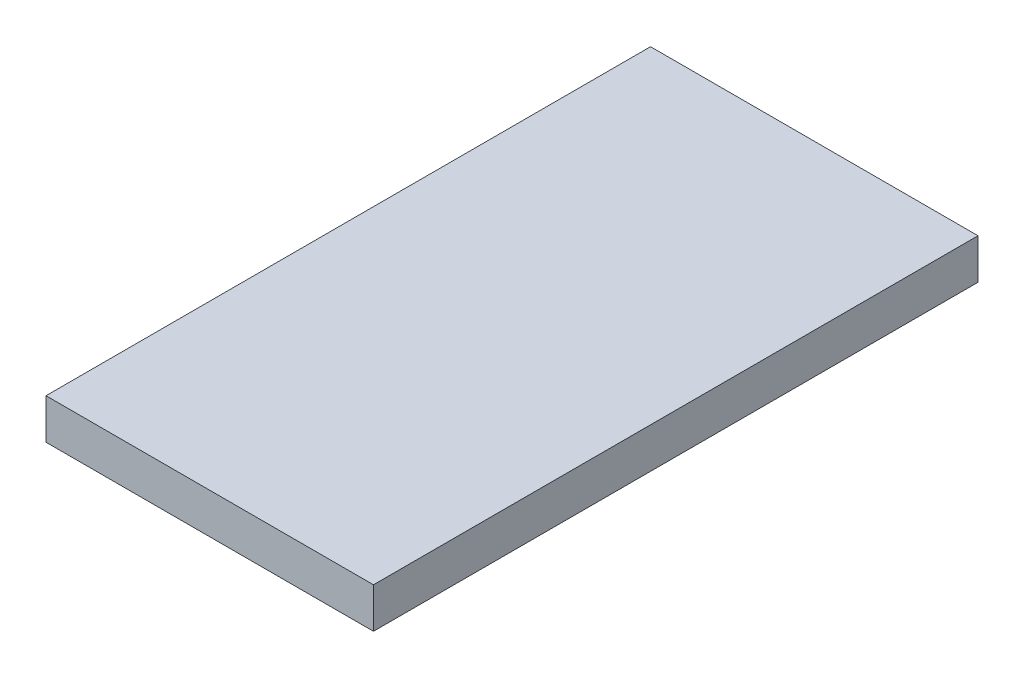
ISO-10303-21;
HEADER;
FILE_DESCRIPTION(('STEP AP214'),'2;1');
FILE_NAME('part.step','',(''),(''),'','','');
FILE_SCHEMA(('AUTOMOTIVE_DESIGN { 1 0 10303 214 1 1 1 1 }'));
ENDSEC;
DATA;
#1=APPLICATION_CONTEXT('core data for automotive mechanical design processes');
#2=APPLICATION_PROTOCOL_DEFINITION('international standard','automotive_design',2000,#1);
#3=PRODUCT_CONTEXT('',#1,'mechanical');
#4=PRODUCT('Part','Part','',(#3));
#5=PRODUCT_RELATED_PRODUCT_CATEGORY('part','',(#4));
#6=PRODUCT_DEFINITION_FORMATION('','',#4);
#7=PRODUCT_DEFINITION_CONTEXT('part definition',#1,'design');
#8=PRODUCT_DEFINITION('design','',#6,#7);
#9=PRODUCT_DEFINITION_SHAPE('','',#8);
#10=(LENGTH_UNIT() NAMED_UNIT(*) SI_UNIT(.MILLI.,.METRE.));
#11=(NAMED_UNIT(*) PLANE_ANGLE_UNIT() SI_UNIT($,.RADIAN.));
#12=(NAMED_UNIT(*) SI_UNIT($,.STERADIAN.) SOLID_ANGLE_UNIT());
#13=UNCERTAINTY_MEASURE_WITH_UNIT(LENGTH_MEASURE(1.E-05),#10,'distance_accuracy_value','');
#14=(GEOMETRIC_REPRESENTATION_CONTEXT(3) GLOBAL_UNCERTAINTY_ASSIGNED_CONTEXT((#13)) GLOBAL_UNIT_ASSIGNED_CONTEXT((#10,
#11,#12)) REPRESENTATION_CONTEXT('',''));
#15=CARTESIAN_POINT('',(0.,0.,0.));
#16=DIRECTION('',(0.,0.,1.));
#17=DIRECTION('',(1.,0.,0.));
#18=AXIS2_PLACEMENT_3D('',#15,#16,#17);
#19=CARTESIAN_POINT('',(41.275,10.16,-76.2));
#20=DIRECTION('',(-1.,0.,0.));
#21=DIRECTION('',(0.,0.,1.));
#22=AXIS2_PLACEMENT_3D('',#19,#20,#21);
#23=PLANE('',#22);
#24=DIRECTION('',(0.,0.,-1.));
#25=VECTOR('',#24,1.);
#26=CARTESIAN_POINT('',(41.275,0.,-76.2));
#27=LINE('',#26,#25);
#28=CARTESIAN_POINT('',(41.275,0.,76.2));
#29=VERTEX_POINT('',#28);
#30=CARTESIAN_POINT('',(41.275,0.,-76.2));
#31=VERTEX_POINT('',#30);
#32=EDGE_CURVE('E105',#29,#31,#27,.T.);
#33=ORIENTED_EDGE('',*,*,#32,.T.);
#34=DIRECTION('',(0.,-1.,0.));
#35=VECTOR('',#34,1.);
#36=CARTESIAN_POINT('',(41.275,10.16,-76.2));
#37=LINE('',#36,#35);
#38=CARTESIAN_POINT('',(41.275,10.16,-76.2));
#39=VERTEX_POINT('',#38);
#40=EDGE_CURVE('E11',#39,#31,#37,.T.);
#41=ORIENTED_EDGE('',*,*,#40,.F.);
#42=DIRECTION('',(0.,0.,-1.));
#43=VECTOR('',#42,1.);
#44=CARTESIAN_POINT('',(41.275,10.16,-76.2));
#45=LINE('',#44,#43);
#46=CARTESIAN_POINT('',(41.275,10.16,76.2));
#47=VERTEX_POINT('',#46);
#48=EDGE_CURVE('E93',#47,#39,#45,.T.);
#49=ORIENTED_EDGE('',*,*,#48,.F.);
#50=DIRECTION('',(0.,-1.,0.));
#51=VECTOR('',#50,1.);
#52=CARTESIAN_POINT('',(41.275,10.16,76.2));
#53=LINE('',#52,#51);
#54=EDGE_CURVE('E101',#47,#29,#53,.T.);
#55=ORIENTED_EDGE('',*,*,#54,.T.);
#56=EDGE_LOOP('',(#33,#41,#49,#55));
#57=FACE_BOUND('',#56,.T.);
#58=ADVANCED_FACE('F42',(#57),#23,.F.);
#59=CARTESIAN_POINT('',(-41.275,10.16,-76.2));
#60=DIRECTION('',(0.,0.,1.));
#61=DIRECTION('',(1.,0.,0.));
#62=AXIS2_PLACEMENT_3D('',#59,#60,#61);
#63=PLANE('',#62);
#64=DIRECTION('',(-1.,0.,0.));
#65=VECTOR('',#64,1.);
#66=CARTESIAN_POINT('',(-41.275,0.,-76.2));
#67=LINE('',#66,#65);
#68=CARTESIAN_POINT('',(-41.275,0.,-76.2));
#69=VERTEX_POINT('',#68);
#70=EDGE_CURVE('E97',#31,#69,#67,.T.);
#71=ORIENTED_EDGE('',*,*,#70,.T.);
#72=DIRECTION('',(0.,-1.,0.));
#73=VECTOR('',#72,1.);
#74=CARTESIAN_POINT('',(-41.275,10.16,-76.2));
#75=LINE('',#74,#73);
#76=CARTESIAN_POINT('',(-41.275,10.16,-76.2));
#77=VERTEX_POINT('',#76);
#78=EDGE_CURVE('E50',#77,#69,#75,.T.);
#79=ORIENTED_EDGE('',*,*,#78,.F.);
#80=DIRECTION('',(-1.,0.,0.));
#81=VECTOR('',#80,1.);
#82=CARTESIAN_POINT('',(-41.275,10.16,-76.2));
#83=LINE('',#82,#81);
#84=EDGE_CURVE('E88',#39,#77,#83,.T.);
#85=ORIENTED_EDGE('',*,*,#84,.F.);
#86=ORIENTED_EDGE('',*,*,#40,.T.);
#87=EDGE_LOOP('',(#71,#79,#85,#86));
#88=FACE_BOUND('',#87,.T.);
#89=ADVANCED_FACE('F96',(#88),#63,.F.);
#90=CARTESIAN_POINT('',(-41.275,10.16,-76.2));
#91=DIRECTION('',(1.,0.,0.));
#92=DIRECTION('',(0.,0.,-1.));
#93=AXIS2_PLACEMENT_3D('',#90,#91,#92);
#94=PLANE('',#93);
#95=DIRECTION('',(0.,0.,1.));
#96=VECTOR('',#95,1.);
#97=CARTESIAN_POINT('',(-41.275,0.,-76.2));
#98=LINE('',#97,#96);
#99=CARTESIAN_POINT('',(-41.275,0.,76.2));
#100=VERTEX_POINT('',#99);
#101=EDGE_CURVE('E75',#69,#100,#98,.T.);
#102=ORIENTED_EDGE('',*,*,#101,.T.);
#103=DIRECTION('',(0.,-1.,0.));
#104=VECTOR('',#103,1.);
#105=CARTESIAN_POINT('',(-41.275,10.16,76.2));
#106=LINE('',#105,#104);
#107=CARTESIAN_POINT('',(-41.275,10.16,76.2));
#108=VERTEX_POINT('',#107);
#109=EDGE_CURVE('E98',#108,#100,#106,.T.);
#110=ORIENTED_EDGE('',*,*,#109,.F.);
#111=DIRECTION('',(0.,0.,1.));
#112=VECTOR('',#111,1.);
#113=CARTESIAN_POINT('',(-41.275,10.16,-76.2));
#114=LINE('',#113,#112);
#115=EDGE_CURVE('E91',#77,#108,#114,.T.);
#116=ORIENTED_EDGE('',*,*,#115,.F.);
#117=ORIENTED_EDGE('',*,*,#78,.T.);
#118=EDGE_LOOP('',(#102,#110,#116,#117));
#119=FACE_BOUND('',#118,.T.);
#120=ADVANCED_FACE('F99',(#119),#94,.F.);
#121=CARTESIAN_POINT('',(-41.275,10.16,76.2));
#122=DIRECTION('',(0.,0.,-1.));
#123=DIRECTION('',(-1.,0.,0.));
#124=AXIS2_PLACEMENT_3D('',#121,#122,#123);
#125=PLANE('',#124);
#126=DIRECTION('',(1.,0.,0.));
#127=VECTOR('',#126,1.);
#128=CARTESIAN_POINT('',(-41.275,0.,76.2));
#129=LINE('',#128,#127);
#130=EDGE_CURVE('E81',#100,#29,#129,.T.);
#131=ORIENTED_EDGE('',*,*,#130,.T.);
#132=ORIENTED_EDGE('',*,*,#54,.F.);
#133=DIRECTION('',(1.,0.,0.));
#134=VECTOR('',#133,1.);
#135=CARTESIAN_POINT('',(-41.275,10.16,76.2));
#136=LINE('',#135,#134);
#137=EDGE_CURVE('E58',#108,#47,#136,.T.);
#138=ORIENTED_EDGE('',*,*,#137,.F.);
#139=ORIENTED_EDGE('',*,*,#109,.T.);
#140=EDGE_LOOP('',(#131,#132,#138,#139));
#141=FACE_BOUND('',#140,.T.);
#142=ADVANCED_FACE('F112',(#141),#125,.F.);
#143=CARTESIAN_POINT('',(0.,10.16,0.));
#144=DIRECTION('',(0.,1.,0.));
#145=DIRECTION('',(0.,0.,1.));
#146=AXIS2_PLACEMENT_3D('',#143,#144,#145);
#147=PLANE('',#146);
#148=ORIENTED_EDGE('',*,*,#48,.T.);
#149=ORIENTED_EDGE('',*,*,#84,.T.);
#150=ORIENTED_EDGE('',*,*,#115,.T.);
#151=ORIENTED_EDGE('',*,*,#137,.T.);
#152=EDGE_LOOP('',(#148,#149,#150,#151));
#153=FACE_BOUND('',#152,.T.);
#154=ADVANCED_FACE('F89',(#153),#147,.T.);
#155=CARTESIAN_POINT('',(0.,0.,0.));
#156=DIRECTION('',(0.,1.,0.));
#157=DIRECTION('',(0.,0.,1.));
#158=AXIS2_PLACEMENT_3D('',#155,#156,#157);
#159=PLANE('',#158);
#160=ORIENTED_EDGE('',*,*,#32,.F.);
#161=ORIENTED_EDGE('',*,*,#130,.F.);
#162=ORIENTED_EDGE('',*,*,#101,.F.);
#163=ORIENTED_EDGE('',*,*,#70,.F.);
#164=EDGE_LOOP('',(#160,#161,#162,#163));
#165=FACE_BOUND('',#164,.T.);
#166=ADVANCED_FACE('F115',(#165),#159,.F.);
#167=CLOSED_SHELL('',(#58,#89,#120,#142,#154,#166));
#168=MANIFOLD_SOLID_BREP('B2',#167);
#169=ADVANCED_BREP_SHAPE_REPRESENTATION('',(#18,#168),#14);
#170=SHAPE_DEFINITION_REPRESENTATION(#9,#169);
ENDSEC;
END-ISO-10303-21;
